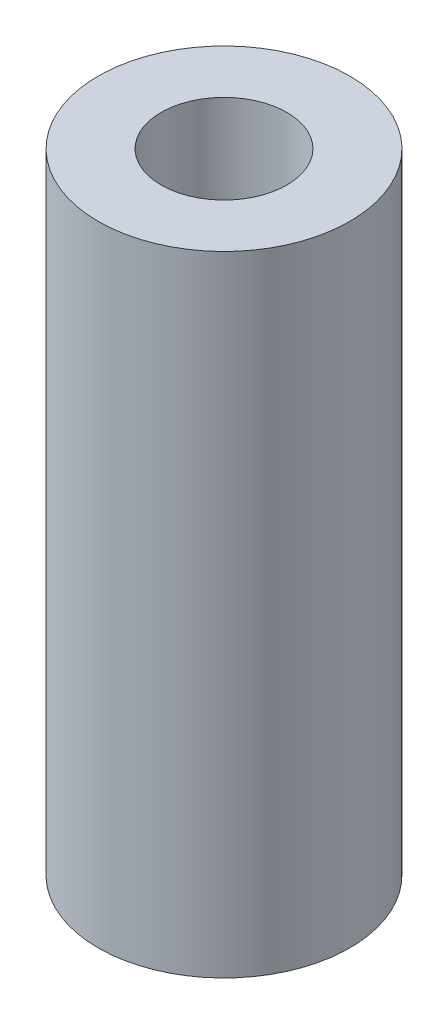
ISO-10303-21;
HEADER;
FILE_DESCRIPTION(('STEP AP214'),'2;1');
FILE_NAME('part.step','',(''),(''),'','','');
FILE_SCHEMA(('AUTOMOTIVE_DESIGN { 1 0 10303 214 1 1 1 1 }'));
ENDSEC;
DATA;
#1=APPLICATION_CONTEXT('core data for automotive mechanical design processes');
#2=APPLICATION_PROTOCOL_DEFINITION('international standard','automotive_design',2000,#1);
#3=PRODUCT_CONTEXT('',#1,'mechanical');
#4=PRODUCT('Part','Part','',(#3));
#5=PRODUCT_RELATED_PRODUCT_CATEGORY('part','',(#4));
#6=PRODUCT_DEFINITION_FORMATION('','',#4);
#7=PRODUCT_DEFINITION_CONTEXT('part definition',#1,'design');
#8=PRODUCT_DEFINITION('design','',#6,#7);
#9=PRODUCT_DEFINITION_SHAPE('','',#8);
#10=(LENGTH_UNIT() NAMED_UNIT(*) SI_UNIT(.MILLI.,.METRE.));
#11=(NAMED_UNIT(*) PLANE_ANGLE_UNIT() SI_UNIT($,.RADIAN.));
#12=(NAMED_UNIT(*) SI_UNIT($,.STERADIAN.) SOLID_ANGLE_UNIT());
#13=UNCERTAINTY_MEASURE_WITH_UNIT(LENGTH_MEASURE(1.E-05),#10,'distance_accuracy_value','');
#14=(GEOMETRIC_REPRESENTATION_CONTEXT(3) GLOBAL_UNCERTAINTY_ASSIGNED_CONTEXT((#13)) GLOBAL_UNIT_ASSIGNED_CONTEXT((#10,
#11,#12)) REPRESENTATION_CONTEXT('',''));
#15=CARTESIAN_POINT('',(0.,0.,0.));
#16=DIRECTION('',(0.,0.,1.));
#17=DIRECTION('',(1.,0.,0.));
#18=AXIS2_PLACEMENT_3D('',#15,#16,#17);
#19=CARTESIAN_POINT('',(0.,254.,0.));
#20=DIRECTION('',(0.,1.,0.));
#21=DIRECTION('',(0.,0.,1.));
#22=AXIS2_PLACEMENT_3D('',#19,#20,#21);
#23=PLANE('',#22);
#24=CARTESIAN_POINT('',(0.,254.,0.));
#25=DIRECTION('',(0.,1.,0.));
#26=DIRECTION('',(0.,0.,1.));
#27=AXIS2_PLACEMENT_3D('',#24,#25,#26);
#28=CIRCLE('',#27,50.8);
#29=CARTESIAN_POINT('',(0.,254.,50.8));
#30=VERTEX_POINT('',#29);
#31=EDGE_CURVE('E10',#30,#30,#28,.T.);
#32=ORIENTED_EDGE('',*,*,#31,.T.);
#33=EDGE_LOOP('',(#32));
#34=FACE_BOUND('',#33,.T.);
#35=CARTESIAN_POINT('',(0.,254.,0.));
#36=DIRECTION('',(0.,1.,0.));
#37=DIRECTION('',(0.,0.,1.));
#38=AXIS2_PLACEMENT_3D('',#35,#36,#37);
#39=CIRCLE('',#38,25.4);
#40=CARTESIAN_POINT('',(0.,254.,25.4));
#41=VERTEX_POINT('',#40);
#42=EDGE_CURVE('E42',#41,#41,#39,.T.);
#43=ORIENTED_EDGE('',*,*,#42,.F.);
#44=EDGE_LOOP('',(#43));
#45=FACE_BOUND('',#44,.T.);
#46=ADVANCED_FACE('F31',(#34,#45),#23,.T.);
#47=CARTESIAN_POINT('',(0.,0.,0.));
#48=DIRECTION('',(0.,1.,0.));
#49=DIRECTION('',(0.,0.,1.));
#50=AXIS2_PLACEMENT_3D('',#47,#48,#49);
#51=PLANE('',#50);
#52=CARTESIAN_POINT('',(0.,0.,0.));
#53=DIRECTION('',(0.,1.,0.));
#54=DIRECTION('',(0.,0.,1.));
#55=AXIS2_PLACEMENT_3D('',#52,#53,#54);
#56=CIRCLE('',#55,50.8);
#57=CARTESIAN_POINT('',(0.,0.,50.8));
#58=VERTEX_POINT('',#57);
#59=EDGE_CURVE('E35',#58,#58,#56,.T.);
#60=ORIENTED_EDGE('',*,*,#59,.F.);
#61=EDGE_LOOP('',(#60));
#62=FACE_BOUND('',#61,.T.);
#63=CARTESIAN_POINT('',(0.,0.,0.));
#64=DIRECTION('',(0.,1.,0.));
#65=DIRECTION('',(0.,0.,1.));
#66=AXIS2_PLACEMENT_3D('',#63,#64,#65);
#67=CIRCLE('',#66,25.4);
#68=CARTESIAN_POINT('',(0.,0.,25.4));
#69=VERTEX_POINT('',#68);
#70=EDGE_CURVE('E44',#69,#69,#67,.T.);
#71=ORIENTED_EDGE('',*,*,#70,.T.);
#72=EDGE_LOOP('',(#71));
#73=FACE_BOUND('',#72,.T.);
#74=ADVANCED_FACE('F54',(#62,#73),#51,.F.);
#75=CARTESIAN_POINT('',(0.,254.,0.));
#76=DIRECTION('',(0.,-1.,0.));
#77=DIRECTION('',(0.,0.,-1.));
#78=AXIS2_PLACEMENT_3D('',#75,#76,#77);
#79=CYLINDRICAL_SURFACE('',#78,50.8);
#80=ORIENTED_EDGE('',*,*,#31,.F.);
#81=EDGE_LOOP('',(#80));
#82=FACE_BOUND('',#81,.T.);
#83=ORIENTED_EDGE('',*,*,#59,.T.);
#84=EDGE_LOOP('',(#83));
#85=FACE_BOUND('',#84,.T.);
#86=ADVANCED_FACE('F33',(#82,#85),#79,.T.);
#87=CARTESIAN_POINT('',(0.,254.,0.));
#88=DIRECTION('',(0.,-1.,0.));
#89=DIRECTION('',(0.,0.,-1.));
#90=AXIS2_PLACEMENT_3D('',#87,#88,#89);
#91=CYLINDRICAL_SURFACE('',#90,25.4);
#92=ORIENTED_EDGE('',*,*,#42,.T.);
#93=EDGE_LOOP('',(#92));
#94=FACE_BOUND('',#93,.T.);
#95=ORIENTED_EDGE('',*,*,#70,.F.);
#96=EDGE_LOOP('',(#95));
#97=FACE_BOUND('',#96,.T.);
#98=ADVANCED_FACE('F50',(#94,#97),#91,.F.);
#99=CLOSED_SHELL('',(#46,#74,#86,#98));
#100=MANIFOLD_SOLID_BREP('B2',#99);
#101=ADVANCED_BREP_SHAPE_REPRESENTATION('',(#18,#100),#14);
#102=SHAPE_DEFINITION_REPRESENTATION(#9,#101);
ENDSEC;
END-ISO-10303-21;
